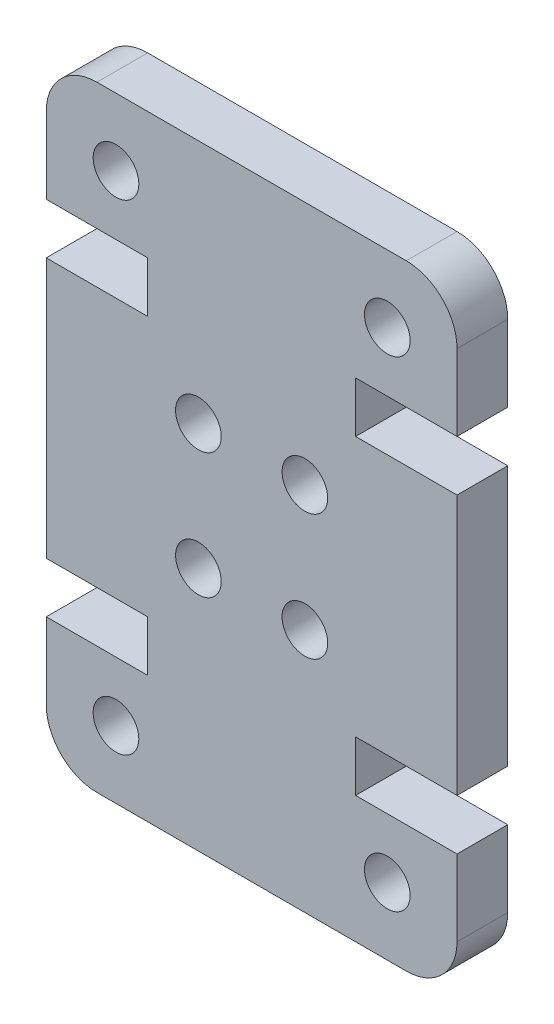
ISO-10303-21;
HEADER;
FILE_DESCRIPTION(('STEP AP214'),'2;1');
FILE_NAME('part.step','',(''),(''),'','','');
FILE_SCHEMA(('AUTOMOTIVE_DESIGN { 1 0 10303 214 1 1 1 1 }'));
ENDSEC;
DATA;
#1=APPLICATION_CONTEXT('core data for automotive mechanical design processes');
#2=APPLICATION_PROTOCOL_DEFINITION('international standard','automotive_design',2000,#1);
#3=PRODUCT_CONTEXT('',#1,'mechanical');
#4=PRODUCT('Part','Part','',(#3));
#5=PRODUCT_RELATED_PRODUCT_CATEGORY('part','',(#4));
#6=PRODUCT_DEFINITION_FORMATION('','',#4);
#7=PRODUCT_DEFINITION_CONTEXT('part definition',#1,'design');
#8=PRODUCT_DEFINITION('design','',#6,#7);
#9=PRODUCT_DEFINITION_SHAPE('','',#8);
#10=(LENGTH_UNIT() NAMED_UNIT(*) SI_UNIT(.MILLI.,.METRE.));
#11=(NAMED_UNIT(*) PLANE_ANGLE_UNIT() SI_UNIT($,.RADIAN.));
#12=(NAMED_UNIT(*) SI_UNIT($,.STERADIAN.) SOLID_ANGLE_UNIT());
#13=UNCERTAINTY_MEASURE_WITH_UNIT(LENGTH_MEASURE(1.E-05),#10,'distance_accuracy_value','');
#14=(GEOMETRIC_REPRESENTATION_CONTEXT(3) GLOBAL_UNCERTAINTY_ASSIGNED_CONTEXT((#13)) GLOBAL_UNIT_ASSIGNED_CONTEXT((#10,
#11,#12)) REPRESENTATION_CONTEXT('',''));
#15=CARTESIAN_POINT('',(0.,0.,0.));
#16=DIRECTION('',(0.,0.,1.));
#17=DIRECTION('',(1.,0.,0.));
#18=AXIS2_PLACEMENT_3D('',#15,#16,#17);
#19=CARTESIAN_POINT('',(14.2,2.,2.));
#20=DIRECTION('',(0.,0.,-1.));
#21=DIRECTION('',(-1.,0.,0.));
#22=AXIS2_PLACEMENT_3D('',#19,#20,#21);
#23=PLANE('',#22);
#24=CARTESIAN_POINT('',(6.00000000000001,9.65355116894447,2.));
#25=DIRECTION('',(0.,0.,1.));
#26=DIRECTION('',(1.,0.,0.));
#27=AXIS2_PLACEMENT_3D('',#24,#25,#26);
#28=CIRCLE('',#27,0.899999999999999);
#29=CARTESIAN_POINT('',(6.9,9.65355116894447,2.));
#30=VERTEX_POINT('',#29);
#31=EDGE_CURVE('E463',#30,#30,#28,.T.);
#32=ORIENTED_EDGE('',*,*,#31,.F.);
#33=EDGE_LOOP('',(#32));
#34=FACE_BOUND('',#33,.T.);
#35=CARTESIAN_POINT('',(10.2,14.6064488310555,2.));
#36=DIRECTION('',(0.,0.,1.));
#37=DIRECTION('',(1.,0.,0.));
#38=AXIS2_PLACEMENT_3D('',#35,#36,#37);
#39=CIRCLE('',#38,0.9);
#40=CARTESIAN_POINT('',(11.1,14.6064488310555,2.));
#41=VERTEX_POINT('',#40);
#42=EDGE_CURVE('E475',#41,#41,#39,.T.);
#43=ORIENTED_EDGE('',*,*,#42,.F.);
#44=EDGE_LOOP('',(#43));
#45=FACE_BOUND('',#44,.T.);
#46=CARTESIAN_POINT('',(2.75000000000003,21.606448831055,2.));
#47=DIRECTION('',(0.,0.,1.));
#48=DIRECTION('',(-1.,0.,0.));
#49=AXIS2_PLACEMENT_3D('',#46,#47,#48);
#50=CIRCLE('',#49,0.9);
#51=CARTESIAN_POINT('',(1.85000000000003,21.606448831055,2.));
#52=VERTEX_POINT('',#51);
#53=EDGE_CURVE('E487',#52,#52,#50,.T.);
#54=ORIENTED_EDGE('',*,*,#53,.F.);
#55=EDGE_LOOP('',(#54));
#56=FACE_BOUND('',#55,.T.);
#57=CARTESIAN_POINT('',(13.45,2.65355116894501,2.));
#58=DIRECTION('',(0.,0.,1.));
#59=DIRECTION('',(-1.,0.,0.));
#60=AXIS2_PLACEMENT_3D('',#57,#58,#59);
#61=CIRCLE('',#60,0.9);
#62=CARTESIAN_POINT('',(12.55,2.65355116894501,2.));
#63=VERTEX_POINT('',#62);
#64=EDGE_CURVE('E229',#63,#63,#61,.T.);
#65=ORIENTED_EDGE('',*,*,#64,.F.);
#66=EDGE_LOOP('',(#65));
#67=FACE_BOUND('',#66,.T.);
#68=CARTESIAN_POINT('',(14.2,2.,2.));
#69=DIRECTION('',(0.,0.,1.));
#70=DIRECTION('',(-1.,0.,0.));
#71=AXIS2_PLACEMENT_3D('',#68,#69,#70);
#72=CIRCLE('',#71,2.);
#73=CARTESIAN_POINT('',(14.2,0.,2.));
#74=VERTEX_POINT('',#73);
#75=CARTESIAN_POINT('',(16.2,2.,2.));
#76=VERTEX_POINT('',#75);
#77=EDGE_CURVE('E272',#74,#76,#72,.T.);
#78=ORIENTED_EDGE('',*,*,#77,.T.);
#79=DIRECTION('',(0.,1.,0.));
#80=VECTOR('',#79,1.);
#81=CARTESIAN_POINT('',(16.2,2.,2.));
#82=LINE('',#81,#80);
#83=CARTESIAN_POINT('',(16.2,4.99999999999945,2.));
#84=VERTEX_POINT('',#83);
#85=EDGE_CURVE('E140',#76,#84,#82,.T.);
#86=ORIENTED_EDGE('',*,*,#85,.T.);
#87=DIRECTION('',(-1.,0.,0.));
#88=VECTOR('',#87,1.);
#89=CARTESIAN_POINT('',(12.2,4.99999999999945,2.));
#90=LINE('',#89,#88);
#91=CARTESIAN_POINT('',(12.2,4.99999999999945,2.));
#92=VERTEX_POINT('',#91);
#93=EDGE_CURVE('E335',#84,#92,#90,.T.);
#94=ORIENTED_EDGE('',*,*,#93,.T.);
#95=DIRECTION('',(0.,1.,0.));
#96=VECTOR('',#95,1.);
#97=CARTESIAN_POINT('',(12.2,6.99999999999945,2.));
#98=LINE('',#97,#96);
#99=CARTESIAN_POINT('',(12.2,6.99999999999945,2.));
#100=VERTEX_POINT('',#99);
#101=EDGE_CURVE('E354',#92,#100,#98,.T.);
#102=ORIENTED_EDGE('',*,*,#101,.T.);
#103=DIRECTION('',(1.,0.,0.));
#104=VECTOR('',#103,1.);
#105=CARTESIAN_POINT('',(16.2,6.99999999999945,2.));
#106=LINE('',#105,#104);
#107=CARTESIAN_POINT('',(16.2,6.99999999999945,2.));
#108=VERTEX_POINT('',#107);
#109=EDGE_CURVE('E351',#100,#108,#106,.T.);
#110=ORIENTED_EDGE('',*,*,#109,.T.);
#111=DIRECTION('',(0.,1.,0.));
#112=VECTOR('',#111,1.);
#113=CARTESIAN_POINT('',(16.2,17.2600000000005,2.));
#114=LINE('',#113,#112);
#115=CARTESIAN_POINT('',(16.2,17.2600000000005,2.));
#116=VERTEX_POINT('',#115);
#117=EDGE_CURVE('E353',#108,#116,#114,.T.);
#118=ORIENTED_EDGE('',*,*,#117,.T.);
#119=DIRECTION('',(-1.,0.,0.));
#120=VECTOR('',#119,1.);
#121=CARTESIAN_POINT('',(16.2,17.2600000000005,2.));
#122=LINE('',#121,#120);
#123=CARTESIAN_POINT('',(12.2,17.2600000000005,2.));
#124=VERTEX_POINT('',#123);
#125=EDGE_CURVE('E356',#116,#124,#122,.T.);
#126=ORIENTED_EDGE('',*,*,#125,.T.);
#127=DIRECTION('',(0.,1.,0.));
#128=VECTOR('',#127,1.);
#129=CARTESIAN_POINT('',(12.2,17.2600000000005,2.));
#130=LINE('',#129,#128);
#131=CARTESIAN_POINT('',(12.2,19.2600000000005,2.));
#132=VERTEX_POINT('',#131);
#133=EDGE_CURVE('E362',#124,#132,#130,.T.);
#134=ORIENTED_EDGE('',*,*,#133,.T.);
#135=DIRECTION('',(1.,0.,0.));
#136=VECTOR('',#135,1.);
#137=CARTESIAN_POINT('',(12.2,19.2600000000005,2.));
#138=LINE('',#137,#136);
#139=CARTESIAN_POINT('',(16.2,19.2600000000005,2.));
#140=VERTEX_POINT('',#139);
#141=EDGE_CURVE('E364',#132,#140,#138,.T.);
#142=ORIENTED_EDGE('',*,*,#141,.T.);
#143=DIRECTION('',(0.,1.,0.));
#144=VECTOR('',#143,1.);
#145=CARTESIAN_POINT('',(16.2,22.26,2.));
#146=LINE('',#145,#144);
#147=CARTESIAN_POINT('',(16.2,22.26,2.));
#148=VERTEX_POINT('',#147);
#149=EDGE_CURVE('E366',#140,#148,#146,.T.);
#150=ORIENTED_EDGE('',*,*,#149,.T.);
#151=CARTESIAN_POINT('',(14.2,22.26,2.));
#152=DIRECTION('',(0.,0.,1.));
#153=DIRECTION('',(1.,0.,0.));
#154=AXIS2_PLACEMENT_3D('',#151,#152,#153);
#155=CIRCLE('',#154,2.);
#156=CARTESIAN_POINT('',(14.2,24.26,2.));
#157=VERTEX_POINT('',#156);
#158=EDGE_CURVE('E368',#148,#157,#155,.T.);
#159=ORIENTED_EDGE('',*,*,#158,.T.);
#160=DIRECTION('',(-1.,0.,0.));
#161=VECTOR('',#160,1.);
#162=CARTESIAN_POINT('',(1.99999999999999,24.26,2.));
#163=LINE('',#162,#161);
#164=CARTESIAN_POINT('',(1.99999999999999,24.26,2.));
#165=VERTEX_POINT('',#164);
#166=EDGE_CURVE('E370',#157,#165,#163,.T.);
#167=ORIENTED_EDGE('',*,*,#166,.T.);
#168=CARTESIAN_POINT('',(2.,22.26,2.));
#169=DIRECTION('',(0.,0.,1.));
#170=DIRECTION('',(-1.,0.,0.));
#171=AXIS2_PLACEMENT_3D('',#168,#169,#170);
#172=CIRCLE('',#171,2.);
#173=CARTESIAN_POINT('',(0.,22.26,2.));
#174=VERTEX_POINT('',#173);
#175=EDGE_CURVE('E372',#165,#174,#172,.T.);
#176=ORIENTED_EDGE('',*,*,#175,.T.);
#177=DIRECTION('',(0.,-1.,0.));
#178=VECTOR('',#177,1.);
#179=CARTESIAN_POINT('',(0.,22.26,2.));
#180=LINE('',#179,#178);
#181=CARTESIAN_POINT('',(0.,19.2600000000005,2.));
#182=VERTEX_POINT('',#181);
#183=EDGE_CURVE('E374',#174,#182,#180,.T.);
#184=ORIENTED_EDGE('',*,*,#183,.T.);
#185=DIRECTION('',(1.,0.,0.));
#186=VECTOR('',#185,1.);
#187=CARTESIAN_POINT('',(3.99999999999999,19.2600000000005,2.));
#188=LINE('',#187,#186);
#189=CARTESIAN_POINT('',(3.99999999999999,19.2600000000005,2.));
#190=VERTEX_POINT('',#189);
#191=EDGE_CURVE('E376',#182,#190,#188,.T.);
#192=ORIENTED_EDGE('',*,*,#191,.T.);
#193=DIRECTION('',(0.,-1.,0.));
#194=VECTOR('',#193,1.);
#195=CARTESIAN_POINT('',(3.99999999999999,17.2600000000005,2.));
#196=LINE('',#195,#194);
#197=CARTESIAN_POINT('',(3.99999999999999,17.2600000000005,2.));
#198=VERTEX_POINT('',#197);
#199=EDGE_CURVE('E378',#190,#198,#196,.T.);
#200=ORIENTED_EDGE('',*,*,#199,.T.);
#201=DIRECTION('',(-1.,0.,0.));
#202=VECTOR('',#201,1.);
#203=CARTESIAN_POINT('',(0.,17.2600000000005,2.));
#204=LINE('',#203,#202);
#205=CARTESIAN_POINT('',(0.,17.2600000000005,2.));
#206=VERTEX_POINT('',#205);
#207=EDGE_CURVE('E380',#198,#206,#204,.T.);
#208=ORIENTED_EDGE('',*,*,#207,.T.);
#209=DIRECTION('',(0.,-1.,0.));
#210=VECTOR('',#209,1.);
#211=CARTESIAN_POINT('',(0.,17.2600000000005,2.));
#212=LINE('',#211,#210);
#213=CARTESIAN_POINT('',(0.,6.99999999999945,2.));
#214=VERTEX_POINT('',#213);
#215=EDGE_CURVE('E382',#206,#214,#212,.T.);
#216=ORIENTED_EDGE('',*,*,#215,.T.);
#217=DIRECTION('',(1.,0.,0.));
#218=VECTOR('',#217,1.);
#219=CARTESIAN_POINT('',(0.,6.99999999999945,2.));
#220=LINE('',#219,#218);
#221=CARTESIAN_POINT('',(4.,6.99999999999945,2.));
#222=VERTEX_POINT('',#221);
#223=EDGE_CURVE('E384',#214,#222,#220,.T.);
#224=ORIENTED_EDGE('',*,*,#223,.T.);
#225=DIRECTION('',(0.,-1.,0.));
#226=VECTOR('',#225,1.);
#227=CARTESIAN_POINT('',(4.,6.99999999999945,2.));
#228=LINE('',#227,#226);
#229=CARTESIAN_POINT('',(4.,4.99999999999945,2.));
#230=VERTEX_POINT('',#229);
#231=EDGE_CURVE('E386',#222,#230,#228,.T.);
#232=ORIENTED_EDGE('',*,*,#231,.T.);
#233=DIRECTION('',(-1.,0.,0.));
#234=VECTOR('',#233,1.);
#235=CARTESIAN_POINT('',(4.,4.99999999999945,2.));
#236=LINE('',#235,#234);
#237=CARTESIAN_POINT('',(0.,4.99999999999945,2.));
#238=VERTEX_POINT('',#237);
#239=EDGE_CURVE('E207',#230,#238,#236,.T.);
#240=ORIENTED_EDGE('',*,*,#239,.T.);
#241=DIRECTION('',(0.,-1.,0.));
#242=VECTOR('',#241,1.);
#243=CARTESIAN_POINT('',(0.,2.,2.));
#244=LINE('',#243,#242);
#245=CARTESIAN_POINT('',(0.,2.,2.));
#246=VERTEX_POINT('',#245);
#247=EDGE_CURVE('E201',#238,#246,#244,.T.);
#248=ORIENTED_EDGE('',*,*,#247,.T.);
#249=CARTESIAN_POINT('',(2.,2.,2.));
#250=DIRECTION('',(0.,0.,1.));
#251=DIRECTION('',(1.,0.,0.));
#252=AXIS2_PLACEMENT_3D('',#249,#250,#251);
#253=CIRCLE('',#252,2.);
#254=CARTESIAN_POINT('',(2.,0.,2.));
#255=VERTEX_POINT('',#254);
#256=EDGE_CURVE('E205',#246,#255,#253,.T.);
#257=ORIENTED_EDGE('',*,*,#256,.T.);
#258=DIRECTION('',(1.,0.,0.));
#259=VECTOR('',#258,1.);
#260=CARTESIAN_POINT('',(2.,0.,2.));
#261=LINE('',#260,#259);
#262=EDGE_CURVE('E49',#255,#74,#261,.T.);
#263=ORIENTED_EDGE('',*,*,#262,.T.);
#264=EDGE_LOOP('',(#78,#86,#94,#102,#110,#118,#126,#134,#142,#150,#159,#167,#176,#184,#192,#200,
#208,#216,#224,#232,#240,#248,#257,#263));
#265=FACE_BOUND('',#264,.T.);
#266=CARTESIAN_POINT('',(10.2,9.65355116894447,2.));
#267=DIRECTION('',(0.,0.,1.));
#268=DIRECTION('',(-1.,0.,0.));
#269=AXIS2_PLACEMENT_3D('',#266,#267,#268);
#270=CIRCLE('',#269,0.9);
#271=CARTESIAN_POINT('',(9.29999999999999,9.65355116894447,2.));
#272=VERTEX_POINT('',#271);
#273=EDGE_CURVE('E493',#272,#272,#270,.T.);
#274=ORIENTED_EDGE('',*,*,#273,.F.);
#275=EDGE_LOOP('',(#274));
#276=FACE_BOUND('',#275,.T.);
#277=CARTESIAN_POINT('',(6.,14.6064488310555,2.));
#278=DIRECTION('',(0.,0.,1.));
#279=DIRECTION('',(-1.,0.,0.));
#280=AXIS2_PLACEMENT_3D('',#277,#278,#279);
#281=CIRCLE('',#280,0.899999999999999);
#282=CARTESIAN_POINT('',(5.1,14.6064488310555,2.));
#283=VERTEX_POINT('',#282);
#284=EDGE_CURVE('E481',#283,#283,#281,.T.);
#285=ORIENTED_EDGE('',*,*,#284,.F.);
#286=EDGE_LOOP('',(#285));
#287=FACE_BOUND('',#286,.T.);
#288=CARTESIAN_POINT('',(13.45,21.606448831055,2.));
#289=DIRECTION('',(0.,0.,1.));
#290=DIRECTION('',(1.,0.,0.));
#291=AXIS2_PLACEMENT_3D('',#288,#289,#290);
#292=CIRCLE('',#291,0.900000000000001);
#293=CARTESIAN_POINT('',(14.35,21.606448831055,2.));
#294=VERTEX_POINT('',#293);
#295=EDGE_CURVE('E469',#294,#294,#292,.T.);
#296=ORIENTED_EDGE('',*,*,#295,.F.);
#297=EDGE_LOOP('',(#296));
#298=FACE_BOUND('',#297,.T.);
#299=CARTESIAN_POINT('',(2.75000000000003,2.65355116894501,2.));
#300=DIRECTION('',(0.,0.,1.));
#301=DIRECTION('',(1.,0.,0.));
#302=AXIS2_PLACEMENT_3D('',#299,#300,#301);
#303=CIRCLE('',#302,0.9);
#304=CARTESIAN_POINT('',(3.65000000000003,2.65355116894501,2.));
#305=VERTEX_POINT('',#304);
#306=EDGE_CURVE('E454',#305,#305,#303,.T.);
#307=ORIENTED_EDGE('',*,*,#306,.F.);
#308=EDGE_LOOP('',(#307));
#309=FACE_BOUND('',#308,.T.);
#310=ADVANCED_FACE('F32',(#34,#45,#56,#67,#265,#276,#287,#298,#309),#23,.F.);
#311=CARTESIAN_POINT('',(14.2,2.,0.));
#312=DIRECTION('',(0.,0.,-1.));
#313=DIRECTION('',(-1.,0.,0.));
#314=AXIS2_PLACEMENT_3D('',#311,#312,#313);
#315=PLANE('',#314);
#316=CARTESIAN_POINT('',(6.00000000000001,9.65355116894447,0.));
#317=DIRECTION('',(0.,0.,1.));
#318=DIRECTION('',(1.,0.,0.));
#319=AXIS2_PLACEMENT_3D('',#316,#317,#318);
#320=CIRCLE('',#319,0.899999999999999);
#321=CARTESIAN_POINT('',(6.9,9.65355116894447,0.));
#322=VERTEX_POINT('',#321);
#323=EDGE_CURVE('E460',#322,#322,#320,.T.);
#324=ORIENTED_EDGE('',*,*,#323,.T.);
#325=EDGE_LOOP('',(#324));
#326=FACE_BOUND('',#325,.T.);
#327=CARTESIAN_POINT('',(10.2,14.6064488310555,0.));
#328=DIRECTION('',(0.,0.,1.));
#329=DIRECTION('',(1.,0.,0.));
#330=AXIS2_PLACEMENT_3D('',#327,#328,#329);
#331=CIRCLE('',#330,0.9);
#332=CARTESIAN_POINT('',(11.1,14.6064488310555,0.));
#333=VERTEX_POINT('',#332);
#334=EDGE_CURVE('E472',#333,#333,#331,.T.);
#335=ORIENTED_EDGE('',*,*,#334,.T.);
#336=EDGE_LOOP('',(#335));
#337=FACE_BOUND('',#336,.T.);
#338=CARTESIAN_POINT('',(2.75000000000003,21.606448831055,0.));
#339=DIRECTION('',(0.,0.,1.));
#340=DIRECTION('',(-1.,0.,0.));
#341=AXIS2_PLACEMENT_3D('',#338,#339,#340);
#342=CIRCLE('',#341,0.9);
#343=CARTESIAN_POINT('',(1.85000000000003,21.606448831055,0.));
#344=VERTEX_POINT('',#343);
#345=EDGE_CURVE('E484',#344,#344,#342,.T.);
#346=ORIENTED_EDGE('',*,*,#345,.T.);
#347=EDGE_LOOP('',(#346));
#348=FACE_BOUND('',#347,.T.);
#349=CARTESIAN_POINT('',(13.45,2.65355116894501,0.));
#350=DIRECTION('',(0.,0.,1.));
#351=DIRECTION('',(-1.,0.,0.));
#352=AXIS2_PLACEMENT_3D('',#349,#350,#351);
#353=CIRCLE('',#352,0.9);
#354=CARTESIAN_POINT('',(12.55,2.65355116894501,0.));
#355=VERTEX_POINT('',#354);
#356=EDGE_CURVE('E496',#355,#355,#353,.T.);
#357=ORIENTED_EDGE('',*,*,#356,.T.);
#358=EDGE_LOOP('',(#357));
#359=FACE_BOUND('',#358,.T.);
#360=CARTESIAN_POINT('',(14.2,2.,0.));
#361=DIRECTION('',(0.,0.,1.));
#362=DIRECTION('',(-1.,0.,0.));
#363=AXIS2_PLACEMENT_3D('',#360,#361,#362);
#364=CIRCLE('',#363,2.);
#365=CARTESIAN_POINT('',(14.2,0.,0.));
#366=VERTEX_POINT('',#365);
#367=CARTESIAN_POINT('',(16.2,2.,0.));
#368=VERTEX_POINT('',#367);
#369=EDGE_CURVE('E225',#366,#368,#364,.T.);
#370=ORIENTED_EDGE('',*,*,#369,.F.);
#371=DIRECTION('',(1.,0.,0.));
#372=VECTOR('',#371,1.);
#373=CARTESIAN_POINT('',(2.,0.,0.));
#374=LINE('',#373,#372);
#375=CARTESIAN_POINT('',(2.,0.,0.));
#376=VERTEX_POINT('',#375);
#377=EDGE_CURVE('E132',#376,#366,#374,.T.);
#378=ORIENTED_EDGE('',*,*,#377,.F.);
#379=CARTESIAN_POINT('',(2.,2.,0.));
#380=DIRECTION('',(0.,0.,1.));
#381=DIRECTION('',(1.,0.,0.));
#382=AXIS2_PLACEMENT_3D('',#379,#380,#381);
#383=CIRCLE('',#382,2.);
#384=CARTESIAN_POINT('',(0.,2.,0.));
#385=VERTEX_POINT('',#384);
#386=EDGE_CURVE('E126',#385,#376,#383,.T.);
#387=ORIENTED_EDGE('',*,*,#386,.F.);
#388=DIRECTION('',(0.,-1.,0.));
#389=VECTOR('',#388,1.);
#390=CARTESIAN_POINT('',(0.,2.,0.));
#391=LINE('',#390,#389);
#392=CARTESIAN_POINT('',(0.,4.99999999999945,0.));
#393=VERTEX_POINT('',#392);
#394=EDGE_CURVE('E215',#393,#385,#391,.T.);
#395=ORIENTED_EDGE('',*,*,#394,.F.);
#396=DIRECTION('',(-1.,0.,0.));
#397=VECTOR('',#396,1.);
#398=CARTESIAN_POINT('',(4.,4.99999999999945,0.));
#399=LINE('',#398,#397);
#400=CARTESIAN_POINT('',(4.,4.99999999999945,0.));
#401=VERTEX_POINT('',#400);
#402=EDGE_CURVE('E267',#401,#393,#399,.T.);
#403=ORIENTED_EDGE('',*,*,#402,.F.);
#404=DIRECTION('',(0.,-1.,0.));
#405=VECTOR('',#404,1.);
#406=CARTESIAN_POINT('',(4.,6.99999999999945,0.));
#407=LINE('',#406,#405);
#408=CARTESIAN_POINT('',(4.,6.99999999999945,0.));
#409=VERTEX_POINT('',#408);
#410=EDGE_CURVE('E265',#409,#401,#407,.T.);
#411=ORIENTED_EDGE('',*,*,#410,.F.);
#412=DIRECTION('',(1.,0.,0.));
#413=VECTOR('',#412,1.);
#414=CARTESIAN_POINT('',(0.,6.99999999999945,0.));
#415=LINE('',#414,#413);
#416=CARTESIAN_POINT('',(0.,6.99999999999945,0.));
#417=VERTEX_POINT('',#416);
#418=EDGE_CURVE('E263',#417,#409,#415,.T.);
#419=ORIENTED_EDGE('',*,*,#418,.F.);
#420=DIRECTION('',(0.,-1.,0.));
#421=VECTOR('',#420,1.);
#422=CARTESIAN_POINT('',(0.,17.2600000000005,0.));
#423=LINE('',#422,#421);
#424=CARTESIAN_POINT('',(0.,17.2600000000005,0.));
#425=VERTEX_POINT('',#424);
#426=EDGE_CURVE('E261',#425,#417,#423,.T.);
#427=ORIENTED_EDGE('',*,*,#426,.F.);
#428=DIRECTION('',(-1.,0.,0.));
#429=VECTOR('',#428,1.);
#430=CARTESIAN_POINT('',(0.,17.2600000000005,0.));
#431=LINE('',#430,#429);
#432=CARTESIAN_POINT('',(3.99999999999999,17.2600000000005,0.));
#433=VERTEX_POINT('',#432);
#434=EDGE_CURVE('E259',#433,#425,#431,.T.);
#435=ORIENTED_EDGE('',*,*,#434,.F.);
#436=DIRECTION('',(0.,-1.,0.));
#437=VECTOR('',#436,1.);
#438=CARTESIAN_POINT('',(3.99999999999999,17.2600000000005,0.));
#439=LINE('',#438,#437);
#440=CARTESIAN_POINT('',(3.99999999999999,19.2600000000005,0.));
#441=VERTEX_POINT('',#440);
#442=EDGE_CURVE('E257',#441,#433,#439,.T.);
#443=ORIENTED_EDGE('',*,*,#442,.F.);
#444=DIRECTION('',(1.,0.,0.));
#445=VECTOR('',#444,1.);
#446=CARTESIAN_POINT('',(3.99999999999999,19.2600000000005,0.));
#447=LINE('',#446,#445);
#448=CARTESIAN_POINT('',(0.,19.2600000000005,0.));
#449=VERTEX_POINT('',#448);
#450=EDGE_CURVE('E255',#449,#441,#447,.T.);
#451=ORIENTED_EDGE('',*,*,#450,.F.);
#452=DIRECTION('',(0.,-1.,0.));
#453=VECTOR('',#452,1.);
#454=CARTESIAN_POINT('',(0.,22.26,0.));
#455=LINE('',#454,#453);
#456=CARTESIAN_POINT('',(0.,22.26,0.));
#457=VERTEX_POINT('',#456);
#458=EDGE_CURVE('E253',#457,#449,#455,.T.);
#459=ORIENTED_EDGE('',*,*,#458,.F.);
#460=CARTESIAN_POINT('',(2.,22.26,0.));
#461=DIRECTION('',(0.,0.,1.));
#462=DIRECTION('',(-1.,0.,0.));
#463=AXIS2_PLACEMENT_3D('',#460,#461,#462);
#464=CIRCLE('',#463,2.);
#465=CARTESIAN_POINT('',(1.99999999999999,24.26,0.));
#466=VERTEX_POINT('',#465);
#467=EDGE_CURVE('E251',#466,#457,#464,.T.);
#468=ORIENTED_EDGE('',*,*,#467,.F.);
#469=DIRECTION('',(-1.,0.,0.));
#470=VECTOR('',#469,1.);
#471=CARTESIAN_POINT('',(1.99999999999999,24.26,0.));
#472=LINE('',#471,#470);
#473=CARTESIAN_POINT('',(14.2,24.26,0.));
#474=VERTEX_POINT('',#473);
#475=EDGE_CURVE('E249',#474,#466,#472,.T.);
#476=ORIENTED_EDGE('',*,*,#475,.F.);
#477=CARTESIAN_POINT('',(14.2,22.26,0.));
#478=DIRECTION('',(0.,0.,1.));
#479=DIRECTION('',(1.,0.,0.));
#480=AXIS2_PLACEMENT_3D('',#477,#478,#479);
#481=CIRCLE('',#480,2.);
#482=CARTESIAN_POINT('',(16.2,22.26,0.));
#483=VERTEX_POINT('',#482);
#484=EDGE_CURVE('E247',#483,#474,#481,.T.);
#485=ORIENTED_EDGE('',*,*,#484,.F.);
#486=DIRECTION('',(0.,1.,0.));
#487=VECTOR('',#486,1.);
#488=CARTESIAN_POINT('',(16.2,22.26,0.));
#489=LINE('',#488,#487);
#490=CARTESIAN_POINT('',(16.2,19.2600000000005,0.));
#491=VERTEX_POINT('',#490);
#492=EDGE_CURVE('E245',#491,#483,#489,.T.);
#493=ORIENTED_EDGE('',*,*,#492,.F.);
#494=DIRECTION('',(1.,0.,0.));
#495=VECTOR('',#494,1.);
#496=CARTESIAN_POINT('',(12.2,19.2600000000005,0.));
#497=LINE('',#496,#495);
#498=CARTESIAN_POINT('',(12.2,19.2600000000005,0.));
#499=VERTEX_POINT('',#498);
#500=EDGE_CURVE('E243',#499,#491,#497,.T.);
#501=ORIENTED_EDGE('',*,*,#500,.F.);
#502=DIRECTION('',(0.,1.,0.));
#503=VECTOR('',#502,1.);
#504=CARTESIAN_POINT('',(12.2,17.2600000000005,0.));
#505=LINE('',#504,#503);
#506=CARTESIAN_POINT('',(12.2,17.2600000000005,0.));
#507=VERTEX_POINT('',#506);
#508=EDGE_CURVE('E241',#507,#499,#505,.T.);
#509=ORIENTED_EDGE('',*,*,#508,.F.);
#510=DIRECTION('',(-1.,0.,0.));
#511=VECTOR('',#510,1.);
#512=CARTESIAN_POINT('',(16.2,17.2600000000005,0.));
#513=LINE('',#512,#511);
#514=CARTESIAN_POINT('',(16.2,17.2600000000005,0.));
#515=VERTEX_POINT('',#514);
#516=EDGE_CURVE('E239',#515,#507,#513,.T.);
#517=ORIENTED_EDGE('',*,*,#516,.F.);
#518=DIRECTION('',(0.,1.,0.));
#519=VECTOR('',#518,1.);
#520=CARTESIAN_POINT('',(16.2,17.2600000000005,0.));
#521=LINE('',#520,#519);
#522=CARTESIAN_POINT('',(16.2,6.99999999999945,0.));
#523=VERTEX_POINT('',#522);
#524=EDGE_CURVE('E237',#523,#515,#521,.T.);
#525=ORIENTED_EDGE('',*,*,#524,.F.);
#526=DIRECTION('',(1.,0.,0.));
#527=VECTOR('',#526,1.);
#528=CARTESIAN_POINT('',(16.2,6.99999999999945,0.));
#529=LINE('',#528,#527);
#530=CARTESIAN_POINT('',(12.2,6.99999999999945,0.));
#531=VERTEX_POINT('',#530);
#532=EDGE_CURVE('E235',#531,#523,#529,.T.);
#533=ORIENTED_EDGE('',*,*,#532,.F.);
#534=DIRECTION('',(0.,1.,0.));
#535=VECTOR('',#534,1.);
#536=CARTESIAN_POINT('',(12.2,6.99999999999945,0.));
#537=LINE('',#536,#535);
#538=CARTESIAN_POINT('',(12.2,4.99999999999945,0.));
#539=VERTEX_POINT('',#538);
#540=EDGE_CURVE('E233',#539,#531,#537,.T.);
#541=ORIENTED_EDGE('',*,*,#540,.F.);
#542=DIRECTION('',(-1.,0.,0.));
#543=VECTOR('',#542,1.);
#544=CARTESIAN_POINT('',(12.2,4.99999999999945,0.));
#545=LINE('',#544,#543);
#546=CARTESIAN_POINT('',(16.2,4.99999999999945,0.));
#547=VERTEX_POINT('',#546);
#548=EDGE_CURVE('E231',#547,#539,#545,.T.);
#549=ORIENTED_EDGE('',*,*,#548,.F.);
#550=DIRECTION('',(0.,1.,0.));
#551=VECTOR('',#550,1.);
#552=CARTESIAN_POINT('',(16.2,2.,0.));
#553=LINE('',#552,#551);
#554=EDGE_CURVE('E228',#368,#547,#553,.T.);
#555=ORIENTED_EDGE('',*,*,#554,.F.);
#556=EDGE_LOOP('',(#370,#378,#387,#395,#403,#411,#419,#427,#435,#443,#451,#459,#468,#476,#485,
#493,#501,#509,#517,#525,#533,#541,#549,#555));
#557=FACE_BOUND('',#556,.T.);
#558=CARTESIAN_POINT('',(10.2,9.65355116894447,0.));
#559=DIRECTION('',(0.,0.,1.));
#560=DIRECTION('',(-1.,0.,0.));
#561=AXIS2_PLACEMENT_3D('',#558,#559,#560);
#562=CIRCLE('',#561,0.9);
#563=CARTESIAN_POINT('',(9.29999999999999,9.65355116894447,0.));
#564=VERTEX_POINT('',#563);
#565=EDGE_CURVE('E490',#564,#564,#562,.T.);
#566=ORIENTED_EDGE('',*,*,#565,.T.);
#567=EDGE_LOOP('',(#566));
#568=FACE_BOUND('',#567,.T.);
#569=CARTESIAN_POINT('',(6.,14.6064488310555,0.));
#570=DIRECTION('',(0.,0.,1.));
#571=DIRECTION('',(-1.,0.,0.));
#572=AXIS2_PLACEMENT_3D('',#569,#570,#571);
#573=CIRCLE('',#572,0.899999999999999);
#574=CARTESIAN_POINT('',(5.1,14.6064488310555,0.));
#575=VERTEX_POINT('',#574);
#576=EDGE_CURVE('E478',#575,#575,#573,.T.);
#577=ORIENTED_EDGE('',*,*,#576,.T.);
#578=EDGE_LOOP('',(#577));
#579=FACE_BOUND('',#578,.T.);
#580=CARTESIAN_POINT('',(13.45,21.606448831055,0.));
#581=DIRECTION('',(0.,0.,1.));
#582=DIRECTION('',(1.,0.,0.));
#583=AXIS2_PLACEMENT_3D('',#580,#581,#582);
#584=CIRCLE('',#583,0.900000000000001);
#585=CARTESIAN_POINT('',(14.35,21.606448831055,0.));
#586=VERTEX_POINT('',#585);
#587=EDGE_CURVE('E466',#586,#586,#584,.T.);
#588=ORIENTED_EDGE('',*,*,#587,.T.);
#589=EDGE_LOOP('',(#588));
#590=FACE_BOUND('',#589,.T.);
#591=CARTESIAN_POINT('',(2.75000000000003,2.65355116894501,0.));
#592=DIRECTION('',(0.,0.,1.));
#593=DIRECTION('',(1.,0.,0.));
#594=AXIS2_PLACEMENT_3D('',#591,#592,#593);
#595=CIRCLE('',#594,0.9);
#596=CARTESIAN_POINT('',(3.65000000000003,2.65355116894501,0.));
#597=VERTEX_POINT('',#596);
#598=EDGE_CURVE('E457',#597,#597,#595,.T.);
#599=ORIENTED_EDGE('',*,*,#598,.T.);
#600=EDGE_LOOP('',(#599));
#601=FACE_BOUND('',#600,.T.);
#602=ADVANCED_FACE('F339',(#326,#337,#348,#359,#557,#568,#579,#590,#601),#315,.T.);
#603=CARTESIAN_POINT('',(14.2,2.,2.));
#604=DIRECTION('',(0.,0.,-1.));
#605=DIRECTION('',(-1.,0.,0.));
#606=AXIS2_PLACEMENT_3D('',#603,#604,#605);
#607=CYLINDRICAL_SURFACE('',#606,2.);
#608=ORIENTED_EDGE('',*,*,#369,.T.);
#609=DIRECTION('',(0.,0.,-1.));
#610=VECTOR('',#609,1.);
#611=CARTESIAN_POINT('',(16.2,2.,2.));
#612=LINE('',#611,#610);
#613=EDGE_CURVE('E11',#76,#368,#612,.T.);
#614=ORIENTED_EDGE('',*,*,#613,.F.);
#615=ORIENTED_EDGE('',*,*,#77,.F.);
#616=DIRECTION('',(0.,0.,-1.));
#617=VECTOR('',#616,1.);
#618=CARTESIAN_POINT('',(14.2,0.,2.));
#619=LINE('',#618,#617);
#620=EDGE_CURVE('E221',#74,#366,#619,.T.);
#621=ORIENTED_EDGE('',*,*,#620,.T.);
#622=EDGE_LOOP('',(#608,#614,#615,#621));
#623=FACE_BOUND('',#622,.T.);
#624=ADVANCED_FACE('F34',(#623),#607,.T.);
#625=CARTESIAN_POINT('',(16.2,2.,2.));
#626=DIRECTION('',(-1.,0.,0.));
#627=DIRECTION('',(0.,0.,1.));
#628=AXIS2_PLACEMENT_3D('',#625,#626,#627);
#629=PLANE('',#628);
#630=ORIENTED_EDGE('',*,*,#554,.T.);
#631=DIRECTION('',(0.,0.,-1.));
#632=VECTOR('',#631,1.);
#633=CARTESIAN_POINT('',(16.2,4.99999999999945,2.));
#634=LINE('',#633,#632);
#635=EDGE_CURVE('E41',#84,#547,#634,.T.);
#636=ORIENTED_EDGE('',*,*,#635,.F.);
#637=ORIENTED_EDGE('',*,*,#85,.F.);
#638=ORIENTED_EDGE('',*,*,#613,.T.);
#639=EDGE_LOOP('',(#630,#636,#637,#638));
#640=FACE_BOUND('',#639,.T.);
#641=ADVANCED_FACE('F761',(#640),#629,.F.);
#642=CARTESIAN_POINT('',(12.2,4.99999999999945,2.));
#643=DIRECTION('',(0.,-1.,0.));
#644=DIRECTION('',(0.,0.,-1.));
#645=AXIS2_PLACEMENT_3D('',#642,#643,#644);
#646=PLANE('',#645);
#647=ORIENTED_EDGE('',*,*,#548,.T.);
#648=DIRECTION('',(0.,0.,-1.));
#649=VECTOR('',#648,1.);
#650=CARTESIAN_POINT('',(12.2,4.99999999999945,2.));
#651=LINE('',#650,#649);
#652=EDGE_CURVE('E327',#92,#539,#651,.T.);
#653=ORIENTED_EDGE('',*,*,#652,.F.);
#654=ORIENTED_EDGE('',*,*,#93,.F.);
#655=ORIENTED_EDGE('',*,*,#635,.T.);
#656=EDGE_LOOP('',(#647,#653,#654,#655));
#657=FACE_BOUND('',#656,.T.);
#658=ADVANCED_FACE('F333',(#657),#646,.F.);
#659=CARTESIAN_POINT('',(12.2,6.99999999999945,2.));
#660=DIRECTION('',(-1.,0.,0.));
#661=DIRECTION('',(0.,0.,1.));
#662=AXIS2_PLACEMENT_3D('',#659,#660,#661);
#663=PLANE('',#662);
#664=ORIENTED_EDGE('',*,*,#540,.T.);
#665=DIRECTION('',(0.,0.,-1.));
#666=VECTOR('',#665,1.);
#667=CARTESIAN_POINT('',(12.2,6.99999999999945,2.));
#668=LINE('',#667,#666);
#669=EDGE_CURVE('E324',#100,#531,#668,.T.);
#670=ORIENTED_EDGE('',*,*,#669,.F.);
#671=ORIENTED_EDGE('',*,*,#101,.F.);
#672=ORIENTED_EDGE('',*,*,#652,.T.);
#673=EDGE_LOOP('',(#664,#670,#671,#672));
#674=FACE_BOUND('',#673,.T.);
#675=ADVANCED_FACE('F345',(#674),#663,.F.);
#676=CARTESIAN_POINT('',(16.2,6.99999999999945,2.));
#677=DIRECTION('',(0.,1.,0.));
#678=DIRECTION('',(-1.,0.,0.));
#679=AXIS2_PLACEMENT_3D('',#676,#677,#678);
#680=PLANE('',#679);
#681=ORIENTED_EDGE('',*,*,#532,.T.);
#682=DIRECTION('',(0.,0.,-1.));
#683=VECTOR('',#682,1.);
#684=CARTESIAN_POINT('',(16.2,6.99999999999945,2.));
#685=LINE('',#684,#683);
#686=EDGE_CURVE('E321',#108,#523,#685,.T.);
#687=ORIENTED_EDGE('',*,*,#686,.F.);
#688=ORIENTED_EDGE('',*,*,#109,.F.);
#689=ORIENTED_EDGE('',*,*,#669,.T.);
#690=EDGE_LOOP('',(#681,#687,#688,#689));
#691=FACE_BOUND('',#690,.T.);
#692=ADVANCED_FACE('F349',(#691),#680,.F.);
#693=CARTESIAN_POINT('',(16.2,17.2600000000005,2.));
#694=DIRECTION('',(-1.,0.,0.));
#695=DIRECTION('',(0.,0.,1.));
#696=AXIS2_PLACEMENT_3D('',#693,#694,#695);
#697=PLANE('',#696);
#698=ORIENTED_EDGE('',*,*,#524,.T.);
#699=DIRECTION('',(0.,0.,-1.));
#700=VECTOR('',#699,1.);
#701=CARTESIAN_POINT('',(16.2,17.2600000000005,2.));
#702=LINE('',#701,#700);
#703=EDGE_CURVE('E318',#116,#515,#702,.T.);
#704=ORIENTED_EDGE('',*,*,#703,.F.);
#705=ORIENTED_EDGE('',*,*,#117,.F.);
#706=ORIENTED_EDGE('',*,*,#686,.T.);
#707=EDGE_LOOP('',(#698,#704,#705,#706));
#708=FACE_BOUND('',#707,.T.);
#709=ADVANCED_FACE('F726',(#708),#697,.F.);
#710=CARTESIAN_POINT('',(16.2,17.2600000000005,2.));
#711=DIRECTION('',(0.,-1.,0.));
#712=DIRECTION('',(0.,0.,-1.));
#713=AXIS2_PLACEMENT_3D('',#710,#711,#712);
#714=PLANE('',#713);
#715=ORIENTED_EDGE('',*,*,#516,.T.);
#716=DIRECTION('',(0.,0.,-1.));
#717=VECTOR('',#716,1.);
#718=CARTESIAN_POINT('',(12.2,17.2600000000005,2.));
#719=LINE('',#718,#717);
#720=EDGE_CURVE('E315',#124,#507,#719,.T.);
#721=ORIENTED_EDGE('',*,*,#720,.F.);
#722=ORIENTED_EDGE('',*,*,#125,.F.);
#723=ORIENTED_EDGE('',*,*,#703,.T.);
#724=EDGE_LOOP('',(#715,#721,#722,#723));
#725=FACE_BOUND('',#724,.T.);
#726=ADVANCED_FACE('F716',(#725),#714,.F.);
#727=CARTESIAN_POINT('',(12.2,17.2600000000005,2.));
#728=DIRECTION('',(-1.,0.,0.));
#729=DIRECTION('',(0.,0.,1.));
#730=AXIS2_PLACEMENT_3D('',#727,#728,#729);
#731=PLANE('',#730);
#732=ORIENTED_EDGE('',*,*,#508,.T.);
#733=DIRECTION('',(0.,0.,-1.));
#734=VECTOR('',#733,1.);
#735=CARTESIAN_POINT('',(12.2,19.2600000000005,2.));
#736=LINE('',#735,#734);
#737=EDGE_CURVE('E312',#132,#499,#736,.T.);
#738=ORIENTED_EDGE('',*,*,#737,.F.);
#739=ORIENTED_EDGE('',*,*,#133,.F.);
#740=ORIENTED_EDGE('',*,*,#720,.T.);
#741=EDGE_LOOP('',(#732,#738,#739,#740));
#742=FACE_BOUND('',#741,.T.);
#743=ADVANCED_FACE('F706',(#742),#731,.F.);
#744=CARTESIAN_POINT('',(12.2,19.2600000000005,2.));
#745=DIRECTION('',(0.,1.,0.));
#746=DIRECTION('',(0.,0.,1.));
#747=AXIS2_PLACEMENT_3D('',#744,#745,#746);
#748=PLANE('',#747);
#749=ORIENTED_EDGE('',*,*,#500,.T.);
#750=DIRECTION('',(0.,0.,-1.));
#751=VECTOR('',#750,1.);
#752=CARTESIAN_POINT('',(16.2,19.2600000000005,2.));
#753=LINE('',#752,#751);
#754=EDGE_CURVE('E309',#140,#491,#753,.T.);
#755=ORIENTED_EDGE('',*,*,#754,.F.);
#756=ORIENTED_EDGE('',*,*,#141,.F.);
#757=ORIENTED_EDGE('',*,*,#737,.T.);
#758=EDGE_LOOP('',(#749,#755,#756,#757));
#759=FACE_BOUND('',#758,.T.);
#760=ADVANCED_FACE('F696',(#759),#748,.F.);
#761=CARTESIAN_POINT('',(16.2,22.26,2.));
#762=DIRECTION('',(-1.,0.,0.));
#763=DIRECTION('',(0.,0.,1.));
#764=AXIS2_PLACEMENT_3D('',#761,#762,#763);
#765=PLANE('',#764);
#766=ORIENTED_EDGE('',*,*,#492,.T.);
#767=DIRECTION('',(0.,0.,-1.));
#768=VECTOR('',#767,1.);
#769=CARTESIAN_POINT('',(16.2,22.26,2.));
#770=LINE('',#769,#768);
#771=EDGE_CURVE('E306',#148,#483,#770,.T.);
#772=ORIENTED_EDGE('',*,*,#771,.F.);
#773=ORIENTED_EDGE('',*,*,#149,.F.);
#774=ORIENTED_EDGE('',*,*,#754,.T.);
#775=EDGE_LOOP('',(#766,#772,#773,#774));
#776=FACE_BOUND('',#775,.T.);
#777=ADVANCED_FACE('F686',(#776),#765,.F.);
#778=CARTESIAN_POINT('',(14.2,22.26,2.));
#779=DIRECTION('',(0.,0.,-1.));
#780=DIRECTION('',(-1.,0.,0.));
#781=AXIS2_PLACEMENT_3D('',#778,#779,#780);
#782=CYLINDRICAL_SURFACE('',#781,2.);
#783=ORIENTED_EDGE('',*,*,#484,.T.);
#784=DIRECTION('',(0.,0.,-1.));
#785=VECTOR('',#784,1.);
#786=CARTESIAN_POINT('',(14.2,24.26,2.));
#787=LINE('',#786,#785);
#788=EDGE_CURVE('E303',#157,#474,#787,.T.);
#789=ORIENTED_EDGE('',*,*,#788,.F.);
#790=ORIENTED_EDGE('',*,*,#158,.F.);
#791=ORIENTED_EDGE('',*,*,#771,.T.);
#792=EDGE_LOOP('',(#783,#789,#790,#791));
#793=FACE_BOUND('',#792,.T.);
#794=ADVANCED_FACE('F676',(#793),#782,.T.);
#795=CARTESIAN_POINT('',(1.99999999999999,24.26,2.));
#796=DIRECTION('',(0.,-1.,0.));
#797=DIRECTION('',(0.,0.,-1.));
#798=AXIS2_PLACEMENT_3D('',#795,#796,#797);
#799=PLANE('',#798);
#800=ORIENTED_EDGE('',*,*,#475,.T.);
#801=DIRECTION('',(0.,0.,-1.));
#802=VECTOR('',#801,1.);
#803=CARTESIAN_POINT('',(1.99999999999999,24.26,2.));
#804=LINE('',#803,#802);
#805=EDGE_CURVE('E300',#165,#466,#804,.T.);
#806=ORIENTED_EDGE('',*,*,#805,.F.);
#807=ORIENTED_EDGE('',*,*,#166,.F.);
#808=ORIENTED_EDGE('',*,*,#788,.T.);
#809=EDGE_LOOP('',(#800,#806,#807,#808));
#810=FACE_BOUND('',#809,.T.);
#811=ADVANCED_FACE('F666',(#810),#799,.F.);
#812=CARTESIAN_POINT('',(2.,22.26,2.));
#813=DIRECTION('',(0.,0.,-1.));
#814=DIRECTION('',(-1.,0.,0.));
#815=AXIS2_PLACEMENT_3D('',#812,#813,#814);
#816=CYLINDRICAL_SURFACE('',#815,2.);
#817=ORIENTED_EDGE('',*,*,#467,.T.);
#818=DIRECTION('',(0.,0.,-1.));
#819=VECTOR('',#818,1.);
#820=CARTESIAN_POINT('',(0.,22.26,2.));
#821=LINE('',#820,#819);
#822=EDGE_CURVE('E297',#174,#457,#821,.T.);
#823=ORIENTED_EDGE('',*,*,#822,.F.);
#824=ORIENTED_EDGE('',*,*,#175,.F.);
#825=ORIENTED_EDGE('',*,*,#805,.T.);
#826=EDGE_LOOP('',(#817,#823,#824,#825));
#827=FACE_BOUND('',#826,.T.);
#828=ADVANCED_FACE('F656',(#827),#816,.T.);
#829=CARTESIAN_POINT('',(0.,22.26,2.));
#830=DIRECTION('',(1.,0.,0.));
#831=DIRECTION('',(0.,1.,0.));
#832=AXIS2_PLACEMENT_3D('',#829,#830,#831);
#833=PLANE('',#832);
#834=ORIENTED_EDGE('',*,*,#458,.T.);
#835=DIRECTION('',(0.,0.,-1.));
#836=VECTOR('',#835,1.);
#837=CARTESIAN_POINT('',(0.,19.2600000000005,2.));
#838=LINE('',#837,#836);
#839=EDGE_CURVE('E294',#182,#449,#838,.T.);
#840=ORIENTED_EDGE('',*,*,#839,.F.);
#841=ORIENTED_EDGE('',*,*,#183,.F.);
#842=ORIENTED_EDGE('',*,*,#822,.T.);
#843=EDGE_LOOP('',(#834,#840,#841,#842));
#844=FACE_BOUND('',#843,.T.);
#845=ADVANCED_FACE('F646',(#844),#833,.F.);
#846=CARTESIAN_POINT('',(3.99999999999999,19.2600000000005,2.));
#847=DIRECTION('',(0.,1.,0.));
#848=DIRECTION('',(-1.,0.,0.));
#849=AXIS2_PLACEMENT_3D('',#846,#847,#848);
#850=PLANE('',#849);
#851=ORIENTED_EDGE('',*,*,#450,.T.);
#852=DIRECTION('',(0.,0.,-1.));
#853=VECTOR('',#852,1.);
#854=CARTESIAN_POINT('',(3.99999999999999,19.2600000000005,2.));
#855=LINE('',#854,#853);
#856=EDGE_CURVE('E291',#190,#441,#855,.T.);
#857=ORIENTED_EDGE('',*,*,#856,.F.);
#858=ORIENTED_EDGE('',*,*,#191,.F.);
#859=ORIENTED_EDGE('',*,*,#839,.T.);
#860=EDGE_LOOP('',(#851,#857,#858,#859));
#861=FACE_BOUND('',#860,.T.);
#862=ADVANCED_FACE('F636',(#861),#850,.F.);
#863=CARTESIAN_POINT('',(3.99999999999999,17.2600000000005,2.));
#864=DIRECTION('',(1.,0.,0.));
#865=DIRECTION('',(0.,0.,-1.));
#866=AXIS2_PLACEMENT_3D('',#863,#864,#865);
#867=PLANE('',#866);
#868=ORIENTED_EDGE('',*,*,#442,.T.);
#869=DIRECTION('',(0.,0.,-1.));
#870=VECTOR('',#869,1.);
#871=CARTESIAN_POINT('',(3.99999999999999,17.2600000000005,2.));
#872=LINE('',#871,#870);
#873=EDGE_CURVE('E288',#198,#433,#872,.T.);
#874=ORIENTED_EDGE('',*,*,#873,.F.);
#875=ORIENTED_EDGE('',*,*,#199,.F.);
#876=ORIENTED_EDGE('',*,*,#856,.T.);
#877=EDGE_LOOP('',(#868,#874,#875,#876));
#878=FACE_BOUND('',#877,.T.);
#879=ADVANCED_FACE('F626',(#878),#867,.F.);
#880=CARTESIAN_POINT('',(0.,17.2600000000005,2.));
#881=DIRECTION('',(0.,-1.,0.));
#882=DIRECTION('',(1.,0.,0.));
#883=AXIS2_PLACEMENT_3D('',#880,#881,#882);
#884=PLANE('',#883);
#885=ORIENTED_EDGE('',*,*,#434,.T.);
#886=DIRECTION('',(0.,0.,-1.));
#887=VECTOR('',#886,1.);
#888=CARTESIAN_POINT('',(0.,17.2600000000005,2.));
#889=LINE('',#888,#887);
#890=EDGE_CURVE('E285',#206,#425,#889,.T.);
#891=ORIENTED_EDGE('',*,*,#890,.F.);
#892=ORIENTED_EDGE('',*,*,#207,.F.);
#893=ORIENTED_EDGE('',*,*,#873,.T.);
#894=EDGE_LOOP('',(#885,#891,#892,#893));
#895=FACE_BOUND('',#894,.T.);
#896=ADVANCED_FACE('F616',(#895),#884,.F.);
#897=CARTESIAN_POINT('',(0.,17.2600000000005,2.));
#898=DIRECTION('',(1.,0.,0.));
#899=DIRECTION('',(0.,1.,0.));
#900=AXIS2_PLACEMENT_3D('',#897,#898,#899);
#901=PLANE('',#900);
#902=ORIENTED_EDGE('',*,*,#426,.T.);
#903=DIRECTION('',(0.,0.,-1.));
#904=VECTOR('',#903,1.);
#905=CARTESIAN_POINT('',(0.,6.99999999999945,2.));
#906=LINE('',#905,#904);
#907=EDGE_CURVE('E282',#214,#417,#906,.T.);
#908=ORIENTED_EDGE('',*,*,#907,.F.);
#909=ORIENTED_EDGE('',*,*,#215,.F.);
#910=ORIENTED_EDGE('',*,*,#890,.T.);
#911=EDGE_LOOP('',(#902,#908,#909,#910));
#912=FACE_BOUND('',#911,.T.);
#913=ADVANCED_FACE('F606',(#912),#901,.F.);
#914=CARTESIAN_POINT('',(0.,6.99999999999945,2.));
#915=DIRECTION('',(0.,1.,0.));
#916=DIRECTION('',(0.,0.,1.));
#917=AXIS2_PLACEMENT_3D('',#914,#915,#916);
#918=PLANE('',#917);
#919=ORIENTED_EDGE('',*,*,#418,.T.);
#920=DIRECTION('',(0.,0.,-1.));
#921=VECTOR('',#920,1.);
#922=CARTESIAN_POINT('',(4.,6.99999999999945,2.));
#923=LINE('',#922,#921);
#924=EDGE_CURVE('E279',#222,#409,#923,.T.);
#925=ORIENTED_EDGE('',*,*,#924,.F.);
#926=ORIENTED_EDGE('',*,*,#223,.F.);
#927=ORIENTED_EDGE('',*,*,#907,.T.);
#928=EDGE_LOOP('',(#919,#925,#926,#927));
#929=FACE_BOUND('',#928,.T.);
#930=ADVANCED_FACE('F597',(#929),#918,.F.);
#931=CARTESIAN_POINT('',(4.,6.99999999999945,2.));
#932=DIRECTION('',(1.,0.,0.));
#933=DIRECTION('',(0.,0.,-1.));
#934=AXIS2_PLACEMENT_3D('',#931,#932,#933);
#935=PLANE('',#934);
#936=ORIENTED_EDGE('',*,*,#410,.T.);
#937=DIRECTION('',(0.,0.,-1.));
#938=VECTOR('',#937,1.);
#939=CARTESIAN_POINT('',(4.,4.99999999999945,2.));
#940=LINE('',#939,#938);
#941=EDGE_CURVE('E276',#230,#401,#940,.T.);
#942=ORIENTED_EDGE('',*,*,#941,.F.);
#943=ORIENTED_EDGE('',*,*,#231,.F.);
#944=ORIENTED_EDGE('',*,*,#924,.T.);
#945=EDGE_LOOP('',(#936,#942,#943,#944));
#946=FACE_BOUND('',#945,.T.);
#947=ADVANCED_FACE('F392',(#946),#935,.F.);
#948=CARTESIAN_POINT('',(4.,4.99999999999945,2.));
#949=DIRECTION('',(0.,-1.,0.));
#950=DIRECTION('',(0.,0.,-1.));
#951=AXIS2_PLACEMENT_3D('',#948,#949,#950);
#952=PLANE('',#951);
#953=ORIENTED_EDGE('',*,*,#402,.T.);
#954=DIRECTION('',(0.,0.,-1.));
#955=VECTOR('',#954,1.);
#956=CARTESIAN_POINT('',(0.,4.99999999999945,2.));
#957=LINE('',#956,#955);
#958=EDGE_CURVE('E216',#238,#393,#957,.T.);
#959=ORIENTED_EDGE('',*,*,#958,.F.);
#960=ORIENTED_EDGE('',*,*,#239,.F.);
#961=ORIENTED_EDGE('',*,*,#941,.T.);
#962=EDGE_LOOP('',(#953,#959,#960,#961));
#963=FACE_BOUND('',#962,.T.);
#964=ADVANCED_FACE('F396',(#963),#952,.F.);
#965=CARTESIAN_POINT('',(0.,2.,2.));
#966=DIRECTION('',(1.,0.,0.));
#967=DIRECTION('',(0.,0.,-1.));
#968=AXIS2_PLACEMENT_3D('',#965,#966,#967);
#969=PLANE('',#968);
#970=ORIENTED_EDGE('',*,*,#394,.T.);
#971=DIRECTION('',(0.,0.,-1.));
#972=VECTOR('',#971,1.);
#973=CARTESIAN_POINT('',(0.,2.,2.));
#974=LINE('',#973,#972);
#975=EDGE_CURVE('E212',#246,#385,#974,.T.);
#976=ORIENTED_EDGE('',*,*,#975,.F.);
#977=ORIENTED_EDGE('',*,*,#247,.F.);
#978=ORIENTED_EDGE('',*,*,#958,.T.);
#979=EDGE_LOOP('',(#970,#976,#977,#978));
#980=FACE_BOUND('',#979,.T.);
#981=ADVANCED_FACE('F213',(#980),#969,.F.);
#982=CARTESIAN_POINT('',(2.,2.,2.));
#983=DIRECTION('',(0.,0.,-1.));
#984=DIRECTION('',(-1.,0.,0.));
#985=AXIS2_PLACEMENT_3D('',#982,#983,#984);
#986=CYLINDRICAL_SURFACE('',#985,2.);
#987=ORIENTED_EDGE('',*,*,#386,.T.);
#988=DIRECTION('',(0.,0.,-1.));
#989=VECTOR('',#988,1.);
#990=CARTESIAN_POINT('',(2.,0.,2.));
#991=LINE('',#990,#989);
#992=EDGE_CURVE('E217',#255,#376,#991,.T.);
#993=ORIENTED_EDGE('',*,*,#992,.F.);
#994=ORIENTED_EDGE('',*,*,#256,.F.);
#995=ORIENTED_EDGE('',*,*,#975,.T.);
#996=EDGE_LOOP('',(#987,#993,#994,#995));
#997=FACE_BOUND('',#996,.T.);
#998=ADVANCED_FACE('F219',(#997),#986,.T.);
#999=CARTESIAN_POINT('',(2.,0.,2.));
#1000=DIRECTION('',(0.,1.,0.));
#1001=DIRECTION('',(-1.,0.,0.));
#1002=AXIS2_PLACEMENT_3D('',#999,#1000,#1001);
#1003=PLANE('',#1002);
#1004=ORIENTED_EDGE('',*,*,#377,.T.);
#1005=ORIENTED_EDGE('',*,*,#620,.F.);
#1006=ORIENTED_EDGE('',*,*,#262,.F.);
#1007=ORIENTED_EDGE('',*,*,#992,.T.);
#1008=EDGE_LOOP('',(#1004,#1005,#1006,#1007));
#1009=FACE_BOUND('',#1008,.T.);
#1010=ADVANCED_FACE('F400',(#1009),#1003,.F.);
#1011=CARTESIAN_POINT('',(13.45,2.65355116894501,2.));
#1012=DIRECTION('',(0.,0.,-1.));
#1013=DIRECTION('',(-1.,0.,0.));
#1014=AXIS2_PLACEMENT_3D('',#1011,#1012,#1013);
#1015=CYLINDRICAL_SURFACE('',#1014,0.9);
#1016=ORIENTED_EDGE('',*,*,#64,.T.);
#1017=EDGE_LOOP('',(#1016));
#1018=FACE_BOUND('',#1017,.T.);
#1019=ORIENTED_EDGE('',*,*,#356,.F.);
#1020=EDGE_LOOP('',(#1019));
#1021=FACE_BOUND('',#1020,.T.);
#1022=ADVANCED_FACE('F402',(#1018,#1021),#1015,.F.);
#1023=CARTESIAN_POINT('',(10.2,9.65355116894447,2.));
#1024=DIRECTION('',(0.,0.,-1.));
#1025=DIRECTION('',(-1.,0.,0.));
#1026=AXIS2_PLACEMENT_3D('',#1023,#1024,#1025);
#1027=CYLINDRICAL_SURFACE('',#1026,0.9);
#1028=ORIENTED_EDGE('',*,*,#273,.T.);
#1029=EDGE_LOOP('',(#1028));
#1030=FACE_BOUND('',#1029,.T.);
#1031=ORIENTED_EDGE('',*,*,#565,.F.);
#1032=EDGE_LOOP('',(#1031));
#1033=FACE_BOUND('',#1032,.T.);
#1034=ADVANCED_FACE('F408',(#1030,#1033),#1027,.F.);
#1035=CARTESIAN_POINT('',(2.75000000000003,21.606448831055,2.));
#1036=DIRECTION('',(0.,0.,-1.));
#1037=DIRECTION('',(-1.,0.,0.));
#1038=AXIS2_PLACEMENT_3D('',#1035,#1036,#1037);
#1039=CYLINDRICAL_SURFACE('',#1038,0.9);
#1040=ORIENTED_EDGE('',*,*,#53,.T.);
#1041=EDGE_LOOP('',(#1040));
#1042=FACE_BOUND('',#1041,.T.);
#1043=ORIENTED_EDGE('',*,*,#345,.F.);
#1044=EDGE_LOOP('',(#1043));
#1045=FACE_BOUND('',#1044,.T.);
#1046=ADVANCED_FACE('F425',(#1042,#1045),#1039,.F.);
#1047=CARTESIAN_POINT('',(6.,14.6064488310555,2.));
#1048=DIRECTION('',(0.,0.,-1.));
#1049=DIRECTION('',(-1.,0.,0.));
#1050=AXIS2_PLACEMENT_3D('',#1047,#1048,#1049);
#1051=CYLINDRICAL_SURFACE('',#1050,0.899999999999999);
#1052=ORIENTED_EDGE('',*,*,#284,.T.);
#1053=EDGE_LOOP('',(#1052));
#1054=FACE_BOUND('',#1053,.T.);
#1055=ORIENTED_EDGE('',*,*,#576,.F.);
#1056=EDGE_LOOP('',(#1055));
#1057=FACE_BOUND('',#1056,.T.);
#1058=ADVANCED_FACE('F429',(#1054,#1057),#1051,.F.);
#1059=CARTESIAN_POINT('',(10.2,14.6064488310555,2.));
#1060=DIRECTION('',(0.,0.,-1.));
#1061=DIRECTION('',(-1.,0.,0.));
#1062=AXIS2_PLACEMENT_3D('',#1059,#1060,#1061);
#1063=CYLINDRICAL_SURFACE('',#1062,0.9);
#1064=ORIENTED_EDGE('',*,*,#42,.T.);
#1065=EDGE_LOOP('',(#1064));
#1066=FACE_BOUND('',#1065,.T.);
#1067=ORIENTED_EDGE('',*,*,#334,.F.);
#1068=EDGE_LOOP('',(#1067));
#1069=FACE_BOUND('',#1068,.T.);
#1070=ADVANCED_FACE('F433',(#1066,#1069),#1063,.F.);
#1071=CARTESIAN_POINT('',(13.45,21.606448831055,2.));
#1072=DIRECTION('',(0.,0.,-1.));
#1073=DIRECTION('',(-1.,0.,0.));
#1074=AXIS2_PLACEMENT_3D('',#1071,#1072,#1073);
#1075=CYLINDRICAL_SURFACE('',#1074,0.900000000000001);
#1076=ORIENTED_EDGE('',*,*,#295,.T.);
#1077=EDGE_LOOP('',(#1076));
#1078=FACE_BOUND('',#1077,.T.);
#1079=ORIENTED_EDGE('',*,*,#587,.F.);
#1080=EDGE_LOOP('',(#1079));
#1081=FACE_BOUND('',#1080,.T.);
#1082=ADVANCED_FACE('F437',(#1078,#1081),#1075,.F.);
#1083=CARTESIAN_POINT('',(6.00000000000001,9.65355116894447,2.));
#1084=DIRECTION('',(0.,0.,-1.));
#1085=DIRECTION('',(-1.,0.,0.));
#1086=AXIS2_PLACEMENT_3D('',#1083,#1084,#1085);
#1087=CYLINDRICAL_SURFACE('',#1086,0.899999999999999);
#1088=ORIENTED_EDGE('',*,*,#31,.T.);
#1089=EDGE_LOOP('',(#1088));
#1090=FACE_BOUND('',#1089,.T.);
#1091=ORIENTED_EDGE('',*,*,#323,.F.);
#1092=EDGE_LOOP('',(#1091));
#1093=FACE_BOUND('',#1092,.T.);
#1094=ADVANCED_FACE('F441',(#1090,#1093),#1087,.F.);
#1095=CARTESIAN_POINT('',(2.75000000000003,2.65355116894501,2.));
#1096=DIRECTION('',(0.,0.,-1.));
#1097=DIRECTION('',(-1.,0.,0.));
#1098=AXIS2_PLACEMENT_3D('',#1095,#1096,#1097);
#1099=CYLINDRICAL_SURFACE('',#1098,0.9);
#1100=ORIENTED_EDGE('',*,*,#306,.T.);
#1101=EDGE_LOOP('',(#1100));
#1102=FACE_BOUND('',#1101,.T.);
#1103=ORIENTED_EDGE('',*,*,#598,.F.);
#1104=EDGE_LOOP('',(#1103));
#1105=FACE_BOUND('',#1104,.T.);
#1106=ADVANCED_FACE('F445',(#1102,#1105),#1099,.F.);
#1107=CLOSED_SHELL('',(#310,#602,#624,#641,#658,#675,#692,#709,#726,#743,#760,#777,#794,#811,
#828,#845,#862,#879,#896,#913,#930,#947,#964,#981,#998,#1010,#1022,#1034,#1046,#1058,#1070,
#1082,#1094,#1106));
#1108=MANIFOLD_SOLID_BREP('B2',#1107);
#1109=ADVANCED_BREP_SHAPE_REPRESENTATION('',(#18,#1108),#14);
#1110=SHAPE_DEFINITION_REPRESENTATION(#9,#1109);
ENDSEC;
END-ISO-10303-21;
